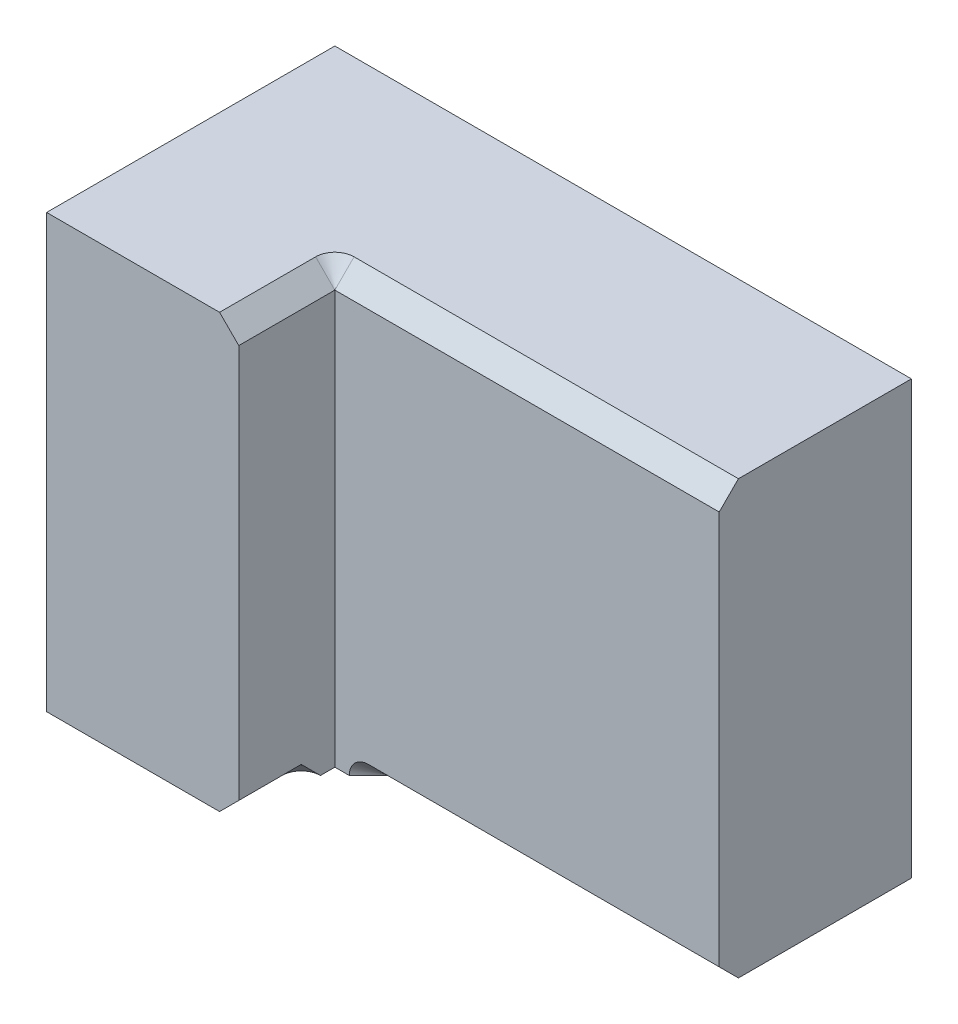
ISO-10303-21;
HEADER;
FILE_DESCRIPTION(('STEP AP214'),'2;1');
FILE_NAME('part.step','',(''),(''),'','','');
FILE_SCHEMA(('AUTOMOTIVE_DESIGN { 1 0 10303 214 1 1 1 1 }'));
ENDSEC;
DATA;
#1=APPLICATION_CONTEXT('core data for automotive mechanical design processes');
#2=APPLICATION_PROTOCOL_DEFINITION('international standard','automotive_design',2000,#1);
#3=PRODUCT_CONTEXT('',#1,'mechanical');
#4=PRODUCT('Part','Part','',(#3));
#5=PRODUCT_RELATED_PRODUCT_CATEGORY('part','',(#4));
#6=PRODUCT_DEFINITION_FORMATION('','',#4);
#7=PRODUCT_DEFINITION_CONTEXT('part definition',#1,'design');
#8=PRODUCT_DEFINITION('design','',#6,#7);
#9=PRODUCT_DEFINITION_SHAPE('','',#8);
#10=(LENGTH_UNIT() NAMED_UNIT(*) SI_UNIT(.MILLI.,.METRE.));
#11=(NAMED_UNIT(*) PLANE_ANGLE_UNIT() SI_UNIT($,.RADIAN.));
#12=(NAMED_UNIT(*) SI_UNIT($,.STERADIAN.) SOLID_ANGLE_UNIT());
#13=UNCERTAINTY_MEASURE_WITH_UNIT(LENGTH_MEASURE(1.E-05),#10,'distance_accuracy_value','');
#14=(GEOMETRIC_REPRESENTATION_CONTEXT(3) GLOBAL_UNCERTAINTY_ASSIGNED_CONTEXT((#13)) GLOBAL_UNIT_ASSIGNED_CONTEXT((#10,
#11,#12)) REPRESENTATION_CONTEXT('',''));
#15=CARTESIAN_POINT('',(0.,0.,0.));
#16=DIRECTION('',(0.,0.,1.));
#17=DIRECTION('',(1.,0.,0.));
#18=AXIS2_PLACEMENT_3D('',#15,#16,#17);
#19=CARTESIAN_POINT('',(0.,0.,20.));
#20=DIRECTION('',(0.,0.,-1.));
#21=DIRECTION('',(-1.,0.,0.));
#22=AXIS2_PLACEMENT_3D('',#19,#20,#21);
#23=PLANE('',#22);
#24=DIRECTION('',(1.,0.,0.));
#25=VECTOR('',#24,1.);
#26=CARTESIAN_POINT('',(-30.,-22.5,20.));
#27=LINE('',#26,#25);
#28=CARTESIAN_POINT('',(-9.99999999999999,-22.5,20.));
#29=VERTEX_POINT('',#28);
#30=CARTESIAN_POINT('',(-8.49999999999999,-22.5,20.));
#31=VERTEX_POINT('',#30);
#32=EDGE_CURVE('E156',#29,#31,#27,.T.);
#33=ORIENTED_EDGE('',*,*,#32,.T.);
#34=CARTESIAN_POINT('',(-6.5,-22.5,20.));
#35=DIRECTION('',(0.,0.,-1.));
#36=DIRECTION('',(-1.,0.,0.));
#37=AXIS2_PLACEMENT_3D('',#34,#35,#36);
#38=CIRCLE('',#37,2.);
#39=CARTESIAN_POINT('',(-6.5,-20.5,20.));
#40=VERTEX_POINT('',#39);
#41=EDGE_CURVE('E147',#31,#40,#38,.T.);
#42=ORIENTED_EDGE('',*,*,#41,.T.);
#43=CARTESIAN_POINT('',(30.,-20.5,20.));
#44=DIRECTION('',(-1.,0.,0.));
#45=VECTOR('',#44,1.);
#46=LINE('',#43,#45);
#47=CARTESIAN_POINT('',(30.,-20.5,20.));
#48=VERTEX_POINT('',#47);
#49=EDGE_CURVE('E148',#48,#40,#46,.T.);
#50=ORIENTED_EDGE('',*,*,#49,.F.);
#51=DIRECTION('',(0.,1.,0.));
#52=VECTOR('',#51,1.);
#53=CARTESIAN_POINT('',(30.,-22.5,20.));
#54=LINE('',#53,#52);
#55=CARTESIAN_POINT('',(30.,20.5,20.));
#56=VERTEX_POINT('',#55);
#57=EDGE_CURVE('E289',#48,#56,#54,.T.);
#58=ORIENTED_EDGE('',*,*,#57,.T.);
#59=DIRECTION('',(1.,0.,0.));
#60=VECTOR('',#59,1.);
#61=CARTESIAN_POINT('',(-9.99999999999999,20.5,20.));
#62=LINE('',#61,#60);
#63=CARTESIAN_POINT('',(-9.99999999999999,20.5,20.));
#64=VERTEX_POINT('',#63);
#65=EDGE_CURVE('E220',#64,#56,#62,.T.);
#66=ORIENTED_EDGE('',*,*,#65,.F.);
#67=DIRECTION('',(0.,1.,0.));
#68=VECTOR('',#67,1.);
#69=CARTESIAN_POINT('',(-10.,22.5,20.));
#70=LINE('',#69,#68);
#71=EDGE_CURVE('E213',#29,#64,#70,.T.);
#72=ORIENTED_EDGE('',*,*,#71,.F.);
#73=EDGE_LOOP('',(#33,#42,#50,#58,#66,#72));
#74=FACE_BOUND('',#73,.T.);
#75=ADVANCED_FACE('F49',(#74),#23,.F.);
#76=CARTESIAN_POINT('',(-10.,22.5,30.));
#77=DIRECTION('',(-1.,0.,0.));
#78=DIRECTION('',(0.,-1.,0.));
#79=AXIS2_PLACEMENT_3D('',#76,#77,#78);
#80=PLANE('',#79);
#81=CARTESIAN_POINT('',(-9.99999999999999,-20.5,23.5));
#82=DIRECTION('',(0.,0.,1.));
#83=VECTOR('',#82,1.);
#84=LINE('',#81,#83);
#85=CARTESIAN_POINT('',(-9.99999999999999,-20.5,23.5));
#86=VERTEX_POINT('',#85);
#87=CARTESIAN_POINT('',(-9.99999999999999,-20.5,30.));
#88=VERTEX_POINT('',#87);
#89=EDGE_CURVE('E70',#86,#88,#84,.T.);
#90=ORIENTED_EDGE('',*,*,#89,.F.);
#91=DIRECTION('',(0.,-0.707106781186548,-0.707106781186547));
#92=VECTOR('',#91,1.);
#93=CARTESIAN_POINT('',(-9.99999999999999,-20.5,23.5));
#94=LINE('',#93,#92);
#95=CARTESIAN_POINT('',(-9.99999999999999,-22.5,21.5));
#96=VERTEX_POINT('',#95);
#97=EDGE_CURVE('E317',#86,#96,#94,.T.);
#98=ORIENTED_EDGE('',*,*,#97,.T.);
#99=DIRECTION('',(0.,0.,-1.));
#100=VECTOR('',#99,1.);
#101=CARTESIAN_POINT('',(-9.99999999999999,-22.5,30.));
#102=LINE('',#101,#100);
#103=EDGE_CURVE('E300',#96,#29,#102,.T.);
#104=ORIENTED_EDGE('',*,*,#103,.T.);
#105=ORIENTED_EDGE('',*,*,#71,.T.);
#106=DIRECTION('',(0.,0.,-1.));
#107=VECTOR('',#106,1.);
#108=CARTESIAN_POINT('',(-9.99999999999999,20.5,31.));
#109=LINE('',#108,#107);
#110=CARTESIAN_POINT('',(-9.99999999999999,20.5,30.));
#111=VERTEX_POINT('',#110);
#112=EDGE_CURVE('E223',#111,#64,#109,.T.);
#113=ORIENTED_EDGE('',*,*,#112,.F.);
#114=DIRECTION('',(0.,1.,0.));
#115=VECTOR('',#114,1.);
#116=CARTESIAN_POINT('',(-10.,22.5,30.));
#117=LINE('',#116,#115);
#118=EDGE_CURVE('E248',#88,#111,#117,.T.);
#119=ORIENTED_EDGE('',*,*,#118,.F.);
#120=EDGE_LOOP('',(#90,#98,#104,#105,#113,#119));
#121=FACE_BOUND('',#120,.T.);
#122=ADVANCED_FACE('F336',(#121),#80,.F.);
#123=CARTESIAN_POINT('',(-30.,22.5,20.));
#124=DIRECTION('',(0.,-1.,0.));
#125=DIRECTION('',(0.,0.,-1.));
#126=AXIS2_PLACEMENT_3D('',#123,#124,#125);
#127=PLANE('',#126);
#128=DIRECTION('',(-1.,0.,0.));
#129=VECTOR('',#128,1.);
#130=CARTESIAN_POINT('',(-30.,22.5,30.));
#131=LINE('',#130,#129);
#132=CARTESIAN_POINT('',(-12.,22.5,30.));
#133=VERTEX_POINT('',#132);
#134=CARTESIAN_POINT('',(-30.,22.5,30.));
#135=VERTEX_POINT('',#134);
#136=EDGE_CURVE('E254',#133,#135,#131,.T.);
#137=ORIENTED_EDGE('',*,*,#136,.F.);
#138=DIRECTION('',(0.,0.,-1.));
#139=VECTOR('',#138,1.);
#140=CARTESIAN_POINT('',(-12.,22.5,31.));
#141=LINE('',#140,#139);
#142=CARTESIAN_POINT('',(-12.,22.5,20.));
#143=VERTEX_POINT('',#142);
#144=EDGE_CURVE('E228',#133,#143,#141,.T.);
#145=ORIENTED_EDGE('',*,*,#144,.T.);
#146=CARTESIAN_POINT('',(-10.,22.5,20.));
#147=DIRECTION('',(0.,-1.,0.));
#148=DIRECTION('',(-1.,0.,0.));
#149=AXIS2_PLACEMENT_3D('',#146,#147,#148);
#150=CIRCLE('',#149,2.);
#151=CARTESIAN_POINT('',(-10.,22.5,18.));
#152=VERTEX_POINT('',#151);
#153=EDGE_CURVE('E224',#143,#152,#150,.T.);
#154=ORIENTED_EDGE('',*,*,#153,.T.);
#155=DIRECTION('',(1.,0.,0.));
#156=VECTOR('',#155,1.);
#157=CARTESIAN_POINT('',(-9.99999999999999,22.5,18.));
#158=LINE('',#157,#156);
#159=CARTESIAN_POINT('',(30.,22.5,18.));
#160=VERTEX_POINT('',#159);
#161=EDGE_CURVE('E219',#152,#160,#158,.T.);
#162=ORIENTED_EDGE('',*,*,#161,.T.);
#163=DIRECTION('',(0.,0.,-1.));
#164=VECTOR('',#163,1.);
#165=CARTESIAN_POINT('',(30.,22.5,20.));
#166=LINE('',#165,#164);
#167=CARTESIAN_POINT('',(30.,22.5,0.));
#168=VERTEX_POINT('',#167);
#169=EDGE_CURVE('E249',#160,#168,#166,.T.);
#170=ORIENTED_EDGE('',*,*,#169,.T.);
#171=DIRECTION('',(-1.,0.,0.));
#172=VECTOR('',#171,1.);
#173=CARTESIAN_POINT('',(-30.,22.5,0.));
#174=LINE('',#173,#172);
#175=CARTESIAN_POINT('',(-30.,22.5,0.));
#176=VERTEX_POINT('',#175);
#177=EDGE_CURVE('E306',#168,#176,#174,.T.);
#178=ORIENTED_EDGE('',*,*,#177,.T.);
#179=DIRECTION('',(0.,0.,-1.));
#180=VECTOR('',#179,1.);
#181=CARTESIAN_POINT('',(-30.,22.5,20.));
#182=LINE('',#181,#180);
#183=EDGE_CURVE('E353',#135,#176,#182,.T.);
#184=ORIENTED_EDGE('',*,*,#183,.F.);
#185=EDGE_LOOP('',(#137,#145,#154,#162,#170,#178,#184));
#186=FACE_BOUND('',#185,.T.);
#187=ADVANCED_FACE('F349',(#186),#127,.F.);
#188=CARTESIAN_POINT('',(30.,-22.5,20.));
#189=DIRECTION('',(-1.,0.,0.));
#190=DIRECTION('',(0.,0.,1.));
#191=AXIS2_PLACEMENT_3D('',#188,#189,#190);
#192=PLANE('',#191);
#193=ORIENTED_EDGE('',*,*,#57,.F.);
#194=DIRECTION('',(0.,-0.707106781186548,-0.707106781186547));
#195=VECTOR('',#194,1.);
#196=CARTESIAN_POINT('',(30.,-21.5,19.));
#197=LINE('',#196,#195);
#198=CARTESIAN_POINT('',(30.,-22.5,18.));
#199=VERTEX_POINT('',#198);
#200=EDGE_CURVE('E165',#48,#199,#197,.T.);
#201=ORIENTED_EDGE('',*,*,#200,.T.);
#202=DIRECTION('',(0.,0.,-1.));
#203=VECTOR('',#202,1.);
#204=CARTESIAN_POINT('',(30.,-22.5,20.));
#205=LINE('',#204,#203);
#206=CARTESIAN_POINT('',(30.,-22.5,0.));
#207=VERTEX_POINT('',#206);
#208=EDGE_CURVE('E305',#199,#207,#205,.T.);
#209=ORIENTED_EDGE('',*,*,#208,.T.);
#210=DIRECTION('',(0.,1.,0.));
#211=VECTOR('',#210,1.);
#212=CARTESIAN_POINT('',(30.,-22.5,0.));
#213=LINE('',#212,#211);
#214=EDGE_CURVE('E303',#207,#168,#213,.T.);
#215=ORIENTED_EDGE('',*,*,#214,.T.);
#216=ORIENTED_EDGE('',*,*,#169,.F.);
#217=DIRECTION('',(0.,-0.707106781186547,0.707106781186548));
#218=VECTOR('',#217,1.);
#219=CARTESIAN_POINT('',(30.,20.5,20.));
#220=LINE('',#219,#218);
#221=EDGE_CURVE('E210',#160,#56,#220,.T.);
#222=ORIENTED_EDGE('',*,*,#221,.T.);
#223=EDGE_LOOP('',(#193,#201,#209,#215,#216,#222));
#224=FACE_BOUND('',#223,.T.);
#225=ADVANCED_FACE('F55',(#224),#192,.F.);
#226=CARTESIAN_POINT('',(-30.,-22.5,20.));
#227=DIRECTION('',(1.,0.,0.));
#228=DIRECTION('',(0.,0.,-1.));
#229=AXIS2_PLACEMENT_3D('',#226,#227,#228);
#230=PLANE('',#229);
#231=DIRECTION('',(0.,-1.,0.));
#232=VECTOR('',#231,1.);
#233=CARTESIAN_POINT('',(-30.,-22.5,0.));
#234=LINE('',#233,#232);
#235=CARTESIAN_POINT('',(-30.,-22.5,0.));
#236=VERTEX_POINT('',#235);
#237=EDGE_CURVE('E308',#176,#236,#234,.T.);
#238=ORIENTED_EDGE('',*,*,#237,.T.);
#239=DIRECTION('',(0.,0.,-1.));
#240=VECTOR('',#239,1.);
#241=CARTESIAN_POINT('',(-30.,-22.5,20.));
#242=LINE('',#241,#240);
#243=CARTESIAN_POINT('',(-30.,-22.5,30.));
#244=VERTEX_POINT('',#243);
#245=EDGE_CURVE('E313',#244,#236,#242,.T.);
#246=ORIENTED_EDGE('',*,*,#245,.F.);
#247=DIRECTION('',(0.,-1.,0.));
#248=VECTOR('',#247,1.);
#249=CARTESIAN_POINT('',(-30.,22.5,30.));
#250=LINE('',#249,#248);
#251=EDGE_CURVE('E240',#135,#244,#250,.T.);
#252=ORIENTED_EDGE('',*,*,#251,.F.);
#253=ORIENTED_EDGE('',*,*,#183,.T.);
#254=EDGE_LOOP('',(#238,#246,#252,#253));
#255=FACE_BOUND('',#254,.T.);
#256=ADVANCED_FACE('F279',(#255),#230,.F.);
#257=CARTESIAN_POINT('',(-30.,-22.5,20.));
#258=DIRECTION('',(0.,1.,0.));
#259=DIRECTION('',(0.,0.,1.));
#260=AXIS2_PLACEMENT_3D('',#257,#258,#259);
#261=PLANE('',#260);
#262=CARTESIAN_POINT('',(30.,-22.5,18.));
#263=DIRECTION('',(-1.,0.,0.));
#264=VECTOR('',#263,1.);
#265=LINE('',#262,#264);
#266=CARTESIAN_POINT('',(-6.5,-22.5,18.));
#267=VERTEX_POINT('',#266);
#268=EDGE_CURVE('E13',#199,#267,#265,.T.);
#269=ORIENTED_EDGE('',*,*,#268,.T.);
#270=DIRECTION('',(-0.707106781186547,0.,0.707106781186548));
#271=VECTOR('',#270,1.);
#272=CARTESIAN_POINT('',(-6.5,-22.5,18.));
#273=LINE('',#272,#271);
#274=EDGE_CURVE('E53',#267,#31,#273,.T.);
#275=ORIENTED_EDGE('',*,*,#274,.T.);
#276=ORIENTED_EDGE('',*,*,#32,.F.);
#277=ORIENTED_EDGE('',*,*,#103,.F.);
#278=CARTESIAN_POINT('',(-9.99999999999999,-22.5,23.5));
#279=DIRECTION('',(0.,1.,0.));
#280=DIRECTION('',(0.,0.,1.));
#281=AXIS2_PLACEMENT_3D('',#278,#279,#280);
#282=CIRCLE('',#281,2.);
#283=CARTESIAN_POINT('',(-12.,-22.5,23.5));
#284=VERTEX_POINT('',#283);
#285=EDGE_CURVE('E318',#96,#284,#282,.T.);
#286=ORIENTED_EDGE('',*,*,#285,.T.);
#287=CARTESIAN_POINT('',(-12.,-22.5,23.5));
#288=DIRECTION('',(0.,0.,1.));
#289=VECTOR('',#288,1.);
#290=LINE('',#287,#289);
#291=CARTESIAN_POINT('',(-12.,-22.5,30.));
#292=VERTEX_POINT('',#291);
#293=EDGE_CURVE('E236',#284,#292,#290,.T.);
#294=ORIENTED_EDGE('',*,*,#293,.T.);
#295=DIRECTION('',(1.,0.,0.));
#296=VECTOR('',#295,1.);
#297=CARTESIAN_POINT('',(-30.,-22.5,30.));
#298=LINE('',#297,#296);
#299=EDGE_CURVE('E239',#244,#292,#298,.T.);
#300=ORIENTED_EDGE('',*,*,#299,.F.);
#301=ORIENTED_EDGE('',*,*,#245,.T.);
#302=DIRECTION('',(1.,0.,0.));
#303=VECTOR('',#302,1.);
#304=CARTESIAN_POINT('',(-30.,-22.5,0.));
#305=LINE('',#304,#303);
#306=EDGE_CURVE('E295',#236,#207,#305,.T.);
#307=ORIENTED_EDGE('',*,*,#306,.T.);
#308=ORIENTED_EDGE('',*,*,#208,.F.);
#309=EDGE_LOOP('',(#269,#275,#276,#277,#286,#294,#300,#301,#307,#308));
#310=FACE_BOUND('',#309,.T.);
#311=ADVANCED_FACE('F269',(#310),#261,.F.);
#312=CARTESIAN_POINT('',(0.,0.,0.));
#313=DIRECTION('',(0.,0.,-1.));
#314=DIRECTION('',(-1.,0.,0.));
#315=AXIS2_PLACEMENT_3D('',#312,#313,#314);
#316=PLANE('',#315);
#317=ORIENTED_EDGE('',*,*,#214,.F.);
#318=ORIENTED_EDGE('',*,*,#306,.F.);
#319=ORIENTED_EDGE('',*,*,#237,.F.);
#320=ORIENTED_EDGE('',*,*,#177,.F.);
#321=EDGE_LOOP('',(#317,#318,#319,#320));
#322=FACE_BOUND('',#321,.T.);
#323=ADVANCED_FACE('F280',(#322),#316,.T.);
#324=CARTESIAN_POINT('',(0.,0.,30.));
#325=DIRECTION('',(0.,0.,1.));
#326=DIRECTION('',(1.,0.,0.));
#327=AXIS2_PLACEMENT_3D('',#324,#325,#326);
#328=PLANE('',#327);
#329=DIRECTION('',(-0.707106781186547,-0.707106781186548,0.));
#330=VECTOR('',#329,1.);
#331=CARTESIAN_POINT('',(5.25,-5.25,30.));
#332=LINE('',#331,#330);
#333=EDGE_CURVE('E58',#88,#292,#332,.T.);
#334=ORIENTED_EDGE('',*,*,#333,.F.);
#335=ORIENTED_EDGE('',*,*,#118,.T.);
#336=DIRECTION('',(0.707106781186548,-0.707106781186547,0.));
#337=VECTOR('',#336,1.);
#338=CARTESIAN_POINT('',(-9.99999999999999,20.5,30.));
#339=LINE('',#338,#337);
#340=EDGE_CURVE('E218',#133,#111,#339,.T.);
#341=ORIENTED_EDGE('',*,*,#340,.F.);
#342=ORIENTED_EDGE('',*,*,#136,.T.);
#343=ORIENTED_EDGE('',*,*,#251,.T.);
#344=ORIENTED_EDGE('',*,*,#299,.T.);
#345=EDGE_LOOP('',(#334,#335,#341,#342,#343,#344));
#346=FACE_BOUND('',#345,.T.);
#347=ADVANCED_FACE('F331',(#346),#328,.T.);
#348=CARTESIAN_POINT('',(-9.99999999999999,20.5,31.));
#349=DIRECTION('',(0.707106781186547,0.707106781186548,0.));
#350=DIRECTION('',(-0.707106781186548,0.707106781186547,0.));
#351=AXIS2_PLACEMENT_3D('',#348,#349,#350);
#352=PLANE('',#351);
#353=ORIENTED_EDGE('',*,*,#340,.T.);
#354=ORIENTED_EDGE('',*,*,#112,.T.);
#355=DIRECTION('',(0.707106781186548,-0.707106781186547,0.));
#356=VECTOR('',#355,1.);
#357=CARTESIAN_POINT('',(-9.99999999999999,20.5,20.));
#358=LINE('',#357,#356);
#359=EDGE_CURVE('E225',#143,#64,#358,.T.);
#360=ORIENTED_EDGE('',*,*,#359,.F.);
#361=ORIENTED_EDGE('',*,*,#144,.F.);
#362=EDGE_LOOP('',(#353,#354,#360,#361));
#363=FACE_BOUND('',#362,.T.);
#364=ADVANCED_FACE('F345',(#363),#352,.T.);
#365=CARTESIAN_POINT('',(-10.,22.5,20.));
#366=DIRECTION('',(0.,1.,0.));
#367=DIRECTION('',(0.,0.,1.));
#368=AXIS2_PLACEMENT_3D('',#365,#366,#367);
#369=CONICAL_SURFACE('',#368,2.,0.785398163397446);
#370=ORIENTED_EDGE('',*,*,#359,.T.);
#371=DIRECTION('',(0.,-0.707106781186547,0.707106781186548));
#372=VECTOR('',#371,1.);
#373=CARTESIAN_POINT('',(-9.99999999999999,20.5,20.));
#374=LINE('',#373,#372);
#375=EDGE_CURVE('E77',#152,#64,#374,.T.);
#376=ORIENTED_EDGE('',*,*,#375,.F.);
#377=ORIENTED_EDGE('',*,*,#153,.F.);
#378=EDGE_LOOP('',(#370,#376,#377));
#379=FACE_BOUND('',#378,.T.);
#380=ADVANCED_FACE('F193',(#379),#369,.F.);
#381=CARTESIAN_POINT('',(-9.99999999999999,20.5,20.));
#382=DIRECTION('',(0.,0.707106781186548,0.707106781186547));
#383=DIRECTION('',(0.,-0.707106781186547,0.707106781186548));
#384=AXIS2_PLACEMENT_3D('',#381,#382,#383);
#385=PLANE('',#384);
#386=ORIENTED_EDGE('',*,*,#161,.F.);
#387=ORIENTED_EDGE('',*,*,#375,.T.);
#388=ORIENTED_EDGE('',*,*,#65,.T.);
#389=ORIENTED_EDGE('',*,*,#221,.F.);
#390=EDGE_LOOP('',(#386,#387,#388,#389));
#391=FACE_BOUND('',#390,.T.);
#392=ADVANCED_FACE('F191',(#391),#385,.T.);
#393=CARTESIAN_POINT('',(-9.99999999999999,-20.5,23.5));
#394=DIRECTION('',(-0.707106781186548,0.707106781186547,0.));
#395=DIRECTION('',(-0.707106781186547,-0.707106781186548,0.));
#396=AXIS2_PLACEMENT_3D('',#393,#394,#395);
#397=PLANE('',#396);
#398=ORIENTED_EDGE('',*,*,#333,.T.);
#399=ORIENTED_EDGE('',*,*,#293,.F.);
#400=DIRECTION('',(-0.707106781186547,-0.707106781186548,0.));
#401=VECTOR('',#400,1.);
#402=CARTESIAN_POINT('',(-9.99999999999999,-20.5,23.5));
#403=LINE('',#402,#401);
#404=EDGE_CURVE('E316',#86,#284,#403,.T.);
#405=ORIENTED_EDGE('',*,*,#404,.F.);
#406=ORIENTED_EDGE('',*,*,#89,.T.);
#407=EDGE_LOOP('',(#398,#399,#405,#406));
#408=FACE_BOUND('',#407,.T.);
#409=ADVANCED_FACE('F186',(#408),#397,.F.);
#410=CARTESIAN_POINT('',(-9.99999999999999,-20.5,23.5));
#411=DIRECTION('',(0.,-1.,0.));
#412=DIRECTION('',(0.,0.,-1.));
#413=AXIS2_PLACEMENT_3D('',#410,#411,#412);
#414=CONICAL_SURFACE('',#413,0.,0.785398163397448);
#415=ORIENTED_EDGE('',*,*,#404,.T.);
#416=ORIENTED_EDGE('',*,*,#285,.F.);
#417=ORIENTED_EDGE('',*,*,#97,.F.);
#418=EDGE_LOOP('',(#415,#416,#417));
#419=FACE_BOUND('',#418,.T.);
#420=ADVANCED_FACE('F184',(#419),#414,.F.);
#421=CARTESIAN_POINT('',(32.,-20.5,20.));
#422=DIRECTION('',(0.,0.707106781186547,-0.707106781186548));
#423=DIRECTION('',(0.,0.707106781186548,0.707106781186547));
#424=AXIS2_PLACEMENT_3D('',#421,#422,#423);
#425=PLANE('',#424);
#426=ORIENTED_EDGE('',*,*,#49,.T.);
#427=DIRECTION('',(0.,-0.707106781186548,-0.707106781186547));
#428=VECTOR('',#427,1.);
#429=CARTESIAN_POINT('',(-6.5,-20.5,20.));
#430=LINE('',#429,#428);
#431=EDGE_CURVE('E141',#40,#267,#430,.T.);
#432=ORIENTED_EDGE('',*,*,#431,.T.);
#433=ORIENTED_EDGE('',*,*,#268,.F.);
#434=ORIENTED_EDGE('',*,*,#200,.F.);
#435=EDGE_LOOP('',(#426,#432,#433,#434));
#436=FACE_BOUND('',#435,.T.);
#437=ADVANCED_FACE('F162',(#436),#425,.F.);
#438=CARTESIAN_POINT('',(-6.5,-22.5,18.));
#439=DIRECTION('',(0.,0.,1.));
#440=DIRECTION('',(1.,0.,0.));
#441=AXIS2_PLACEMENT_3D('',#438,#439,#440);
#442=CONICAL_SURFACE('',#441,0.,0.785398163397448);
#443=ORIENTED_EDGE('',*,*,#274,.F.);
#444=ORIENTED_EDGE('',*,*,#431,.F.);
#445=ORIENTED_EDGE('',*,*,#41,.F.);
#446=EDGE_LOOP('',(#443,#444,#445));
#447=FACE_BOUND('',#446,.T.);
#448=ADVANCED_FACE('F143',(#447),#442,.F.);
#449=CLOSED_SHELL('',(#75,#122,#187,#225,#256,#311,#323,#347,#364,#380,#392,#409,#420,#437,#448));
#450=MANIFOLD_SOLID_BREP('B2',#449);
#451=ADVANCED_BREP_SHAPE_REPRESENTATION('',(#18,#450),#14);
#452=SHAPE_DEFINITION_REPRESENTATION(#9,#451);
ENDSEC;
END-ISO-10303-21;
